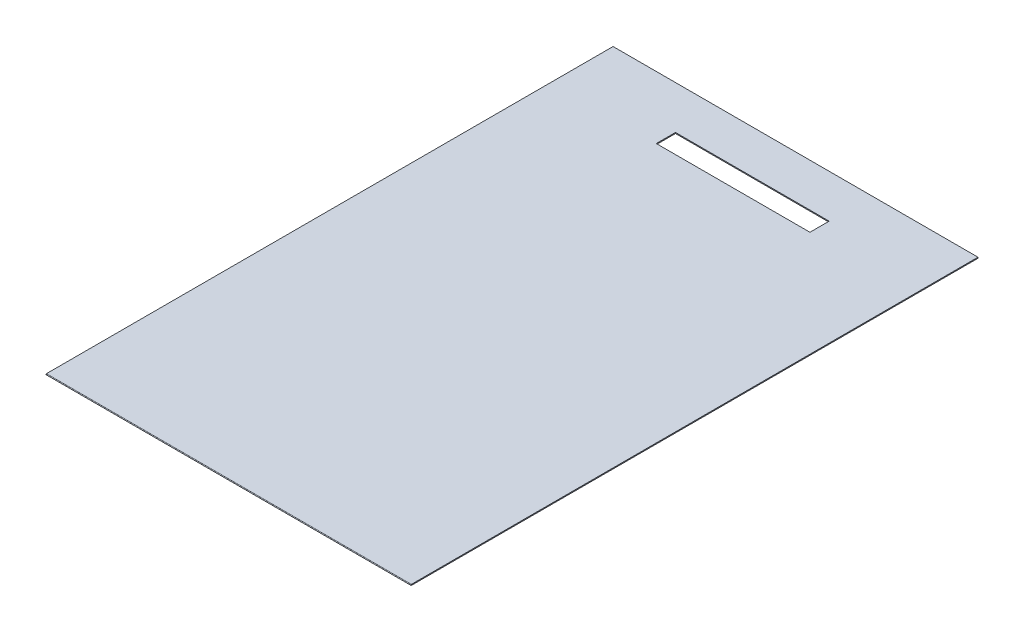
ISO-10303-21;
HEADER;
FILE_DESCRIPTION(('STEP AP214'),'2;1');
FILE_NAME('part.step','',(''),(''),'','','');
FILE_SCHEMA(('AUTOMOTIVE_DESIGN { 1 0 10303 214 1 1 1 1 }'));
ENDSEC;
DATA;
#1=APPLICATION_CONTEXT('core data for automotive mechanical design processes');
#2=APPLICATION_PROTOCOL_DEFINITION('international standard','automotive_design',2000,#1);
#3=PRODUCT_CONTEXT('',#1,'mechanical');
#4=PRODUCT('Part','Part','',(#3));
#5=PRODUCT_RELATED_PRODUCT_CATEGORY('part','',(#4));
#6=PRODUCT_DEFINITION_FORMATION('','',#4);
#7=PRODUCT_DEFINITION_CONTEXT('part definition',#1,'design');
#8=PRODUCT_DEFINITION('design','',#6,#7);
#9=PRODUCT_DEFINITION_SHAPE('','',#8);
#10=(LENGTH_UNIT() NAMED_UNIT(*) SI_UNIT(.MILLI.,.METRE.));
#11=(NAMED_UNIT(*) PLANE_ANGLE_UNIT() SI_UNIT($,.RADIAN.));
#12=(NAMED_UNIT(*) SI_UNIT($,.STERADIAN.) SOLID_ANGLE_UNIT());
#13=UNCERTAINTY_MEASURE_WITH_UNIT(LENGTH_MEASURE(1.E-05),#10,'distance_accuracy_value','');
#14=(GEOMETRIC_REPRESENTATION_CONTEXT(3) GLOBAL_UNCERTAINTY_ASSIGNED_CONTEXT((#13)) GLOBAL_UNIT_ASSIGNED_CONTEXT((#10,
#11,#12)) REPRESENTATION_CONTEXT('',''));
#15=CARTESIAN_POINT('',(0.,0.,0.));
#16=DIRECTION('',(0.,0.,1.));
#17=DIRECTION('',(1.,0.,0.));
#18=AXIS2_PLACEMENT_3D('',#15,#16,#17);
#19=CARTESIAN_POINT('',(0.,0.5,0.));
#20=DIRECTION('',(0.,-1.,0.));
#21=DIRECTION('',(0.,0.,-1.));
#22=AXIS2_PLACEMENT_3D('',#19,#20,#21);
#23=PLANE('',#22);
#24=DIRECTION('',(0.,0.,-1.));
#25=VECTOR('',#24,1.);
#26=CARTESIAN_POINT('',(95.0000000000001,0.5,147.5));
#27=LINE('',#26,#25);
#28=CARTESIAN_POINT('',(95.0000000000001,0.5,147.5));
#29=VERTEX_POINT('',#28);
#30=CARTESIAN_POINT('',(95.0000000000001,0.5,-147.5));
#31=VERTEX_POINT('',#30);
#32=EDGE_CURVE('E141',#29,#31,#27,.T.);
#33=ORIENTED_EDGE('',*,*,#32,.T.);
#34=DIRECTION('',(-1.,0.,0.));
#35=VECTOR('',#34,1.);
#36=CARTESIAN_POINT('',(-95.,0.5,-147.5));
#37=LINE('',#36,#35);
#38=CARTESIAN_POINT('',(-95.,0.5,-147.5));
#39=VERTEX_POINT('',#38);
#40=EDGE_CURVE('E145',#31,#39,#37,.T.);
#41=ORIENTED_EDGE('',*,*,#40,.T.);
#42=DIRECTION('',(0.,0.,1.));
#43=VECTOR('',#42,1.);
#44=CARTESIAN_POINT('',(-95.,0.5,147.5));
#45=LINE('',#44,#43);
#46=CARTESIAN_POINT('',(-94.9999999999999,0.5,147.5));
#47=VERTEX_POINT('',#46);
#48=EDGE_CURVE('E150',#39,#47,#45,.T.);
#49=ORIENTED_EDGE('',*,*,#48,.T.);
#50=DIRECTION('',(1.,0.,0.));
#51=VECTOR('',#50,1.);
#52=CARTESIAN_POINT('',(-95.,0.5,147.5));
#53=LINE('',#52,#51);
#54=EDGE_CURVE('E120',#47,#29,#53,.T.);
#55=ORIENTED_EDGE('',*,*,#54,.T.);
#56=EDGE_LOOP('',(#33,#41,#49,#55));
#57=FACE_BOUND('',#56,.T.);
#58=DIRECTION('',(0.,0.,-1.));
#59=VECTOR('',#58,1.);
#60=CARTESIAN_POINT('',(40.0000000000001,0.5,-125.));
#61=LINE('',#60,#59);
#62=CARTESIAN_POINT('',(40.0000000000001,0.5,-115.));
#63=VERTEX_POINT('',#62);
#64=CARTESIAN_POINT('',(40.0000000000001,0.5,-125.));
#65=VERTEX_POINT('',#64);
#66=EDGE_CURVE('E168',#63,#65,#61,.T.);
#67=ORIENTED_EDGE('',*,*,#66,.F.);
#68=DIRECTION('',(1.,0.,0.));
#69=VECTOR('',#68,1.);
#70=CARTESIAN_POINT('',(-39.9999999999999,0.5,-115.));
#71=LINE('',#70,#69);
#72=CARTESIAN_POINT('',(-39.9999999999999,0.5,-115.));
#73=VERTEX_POINT('',#72);
#74=EDGE_CURVE('E178',#73,#63,#71,.T.);
#75=ORIENTED_EDGE('',*,*,#74,.F.);
#76=DIRECTION('',(0.,0.,1.));
#77=VECTOR('',#76,1.);
#78=CARTESIAN_POINT('',(-39.9999999999999,0.5,-125.));
#79=LINE('',#78,#77);
#80=CARTESIAN_POINT('',(-39.9999999999999,0.5,-125.));
#81=VERTEX_POINT('',#80);
#82=EDGE_CURVE('E175',#81,#73,#79,.T.);
#83=ORIENTED_EDGE('',*,*,#82,.F.);
#84=DIRECTION('',(-1.,0.,0.));
#85=VECTOR('',#84,1.);
#86=CARTESIAN_POINT('',(-39.9999999999999,0.5,-125.));
#87=LINE('',#86,#85);
#88=EDGE_CURVE('E171',#65,#81,#87,.T.);
#89=ORIENTED_EDGE('',*,*,#88,.F.);
#90=EDGE_LOOP('',(#67,#75,#83,#89));
#91=FACE_BOUND('',#90,.T.);
#92=ADVANCED_FACE('F45',(#57,#91),#23,.F.);
#93=CARTESIAN_POINT('',(0.,0.,0.));
#94=DIRECTION('',(0.,-1.,0.));
#95=DIRECTION('',(0.,0.,-1.));
#96=AXIS2_PLACEMENT_3D('',#93,#94,#95);
#97=PLANE('',#96);
#98=DIRECTION('',(0.,0.,-1.));
#99=VECTOR('',#98,1.);
#100=CARTESIAN_POINT('',(95.0000000000001,0.,147.5));
#101=LINE('',#100,#99);
#102=CARTESIAN_POINT('',(95.0000000000001,0.,147.5));
#103=VERTEX_POINT('',#102);
#104=CARTESIAN_POINT('',(95.0000000000001,0.,-147.5));
#105=VERTEX_POINT('',#104);
#106=EDGE_CURVE('E139',#103,#105,#101,.T.);
#107=ORIENTED_EDGE('',*,*,#106,.F.);
#108=DIRECTION('',(1.,0.,0.));
#109=VECTOR('',#108,1.);
#110=CARTESIAN_POINT('',(-95.,0.,147.5));
#111=LINE('',#110,#109);
#112=CARTESIAN_POINT('',(-94.9999999999999,0.,147.5));
#113=VERTEX_POINT('',#112);
#114=EDGE_CURVE('E117',#113,#103,#111,.T.);
#115=ORIENTED_EDGE('',*,*,#114,.F.);
#116=DIRECTION('',(0.,0.,1.));
#117=VECTOR('',#116,1.);
#118=CARTESIAN_POINT('',(-95.,0.,147.5));
#119=LINE('',#118,#117);
#120=CARTESIAN_POINT('',(-95.,0.,-147.5));
#121=VERTEX_POINT('',#120);
#122=EDGE_CURVE('E129',#121,#113,#119,.T.);
#123=ORIENTED_EDGE('',*,*,#122,.F.);
#124=DIRECTION('',(-1.,0.,0.));
#125=VECTOR('',#124,1.);
#126=CARTESIAN_POINT('',(-95.,0.,-147.5));
#127=LINE('',#126,#125);
#128=EDGE_CURVE('E134',#105,#121,#127,.T.);
#129=ORIENTED_EDGE('',*,*,#128,.F.);
#130=EDGE_LOOP('',(#107,#115,#123,#129));
#131=FACE_BOUND('',#130,.T.);
#132=DIRECTION('',(1.,0.,0.));
#133=VECTOR('',#132,1.);
#134=CARTESIAN_POINT('',(-39.9999999999999,0.,-115.));
#135=LINE('',#134,#133);
#136=CARTESIAN_POINT('',(-39.9999999999999,0.,-115.));
#137=VERTEX_POINT('',#136);
#138=CARTESIAN_POINT('',(40.0000000000001,0.,-115.));
#139=VERTEX_POINT('',#138);
#140=EDGE_CURVE('E172',#137,#139,#135,.T.);
#141=ORIENTED_EDGE('',*,*,#140,.T.);
#142=DIRECTION('',(0.,0.,-1.));
#143=VECTOR('',#142,1.);
#144=CARTESIAN_POINT('',(40.0000000000001,0.,-125.));
#145=LINE('',#144,#143);
#146=CARTESIAN_POINT('',(40.0000000000001,0.,-125.));
#147=VERTEX_POINT('',#146);
#148=EDGE_CURVE('E69',#139,#147,#145,.T.);
#149=ORIENTED_EDGE('',*,*,#148,.T.);
#150=DIRECTION('',(-1.,0.,0.));
#151=VECTOR('',#150,1.);
#152=CARTESIAN_POINT('',(-39.9999999999999,0.,-125.));
#153=LINE('',#152,#151);
#154=CARTESIAN_POINT('',(-39.9999999999999,0.,-125.));
#155=VERTEX_POINT('',#154);
#156=EDGE_CURVE('E184',#147,#155,#153,.T.);
#157=ORIENTED_EDGE('',*,*,#156,.T.);
#158=DIRECTION('',(0.,0.,1.));
#159=VECTOR('',#158,1.);
#160=CARTESIAN_POINT('',(-39.9999999999999,0.,-125.));
#161=LINE('',#160,#159);
#162=EDGE_CURVE('E188',#155,#137,#161,.T.);
#163=ORIENTED_EDGE('',*,*,#162,.T.);
#164=EDGE_LOOP('',(#141,#149,#157,#163));
#165=FACE_BOUND('',#164,.T.);
#166=ADVANCED_FACE('F136',(#131,#165),#97,.T.);
#167=CARTESIAN_POINT('',(95.0000000000001,0.5,147.5));
#168=DIRECTION('',(-1.,0.,0.));
#169=DIRECTION('',(0.,0.,1.));
#170=AXIS2_PLACEMENT_3D('',#167,#168,#169);
#171=PLANE('',#170);
#172=ORIENTED_EDGE('',*,*,#106,.T.);
#173=DIRECTION('',(0.,-1.,0.));
#174=VECTOR('',#173,1.);
#175=CARTESIAN_POINT('',(95.0000000000001,0.5,-147.5));
#176=LINE('',#175,#174);
#177=EDGE_CURVE('E11',#31,#105,#176,.T.);
#178=ORIENTED_EDGE('',*,*,#177,.F.);
#179=ORIENTED_EDGE('',*,*,#32,.F.);
#180=CARTESIAN_POINT('',(95.0000000000001,0.25,147.5));
#181=DIRECTION('',(1.,0.,0.));
#182=DIRECTION('',(0.,0.,-1.));
#183=AXIS2_PLACEMENT_3D('',#180,#181,#182);
#184=CIRCLE('',#183,0.25);
#185=EDGE_CURVE('E125',#29,#103,#184,.T.);
#186=ORIENTED_EDGE('',*,*,#185,.T.);
#187=EDGE_LOOP('',(#172,#178,#179,#186));
#188=FACE_BOUND('',#187,.T.);
#189=ADVANCED_FACE('F47',(#188),#171,.F.);
#190=CARTESIAN_POINT('',(-95.,0.5,-147.5));
#191=DIRECTION('',(0.,0.,1.));
#192=DIRECTION('',(1.,0.,0.));
#193=AXIS2_PLACEMENT_3D('',#190,#191,#192);
#194=PLANE('',#193);
#195=ORIENTED_EDGE('',*,*,#128,.T.);
#196=DIRECTION('',(0.,-1.,0.));
#197=VECTOR('',#196,1.);
#198=CARTESIAN_POINT('',(-95.,0.5,-147.5));
#199=LINE('',#198,#197);
#200=EDGE_CURVE('E54',#39,#121,#199,.T.);
#201=ORIENTED_EDGE('',*,*,#200,.F.);
#202=ORIENTED_EDGE('',*,*,#40,.F.);
#203=ORIENTED_EDGE('',*,*,#177,.T.);
#204=EDGE_LOOP('',(#195,#201,#202,#203));
#205=FACE_BOUND('',#204,.T.);
#206=ADVANCED_FACE('F162',(#205),#194,.F.);
#207=CARTESIAN_POINT('',(-95.,0.5,147.5));
#208=DIRECTION('',(1.,0.,0.));
#209=DIRECTION('',(0.,0.,-1.));
#210=AXIS2_PLACEMENT_3D('',#207,#208,#209);
#211=PLANE('',#210);
#212=ORIENTED_EDGE('',*,*,#122,.T.);
#213=CARTESIAN_POINT('',(-94.9999999999999,0.25,147.5));
#214=DIRECTION('',(1.,0.,0.));
#215=DIRECTION('',(0.,0.,-1.));
#216=AXIS2_PLACEMENT_3D('',#213,#214,#215);
#217=CIRCLE('',#216,0.25);
#218=EDGE_CURVE('E113',#47,#113,#217,.T.);
#219=ORIENTED_EDGE('',*,*,#218,.F.);
#220=ORIENTED_EDGE('',*,*,#48,.F.);
#221=ORIENTED_EDGE('',*,*,#200,.T.);
#222=EDGE_LOOP('',(#212,#219,#220,#221));
#223=FACE_BOUND('',#222,.T.);
#224=ADVANCED_FACE('F130',(#223),#211,.F.);
#225=CARTESIAN_POINT('',(40.0000000000001,0.5,-125.));
#226=DIRECTION('',(-1.,0.,0.));
#227=DIRECTION('',(0.,0.,1.));
#228=AXIS2_PLACEMENT_3D('',#225,#226,#227);
#229=PLANE('',#228);
#230=ORIENTED_EDGE('',*,*,#148,.F.);
#231=DIRECTION('',(0.,-1.,0.));
#232=VECTOR('',#231,1.);
#233=CARTESIAN_POINT('',(40.0000000000001,0.5,-115.));
#234=LINE('',#233,#232);
#235=EDGE_CURVE('E181',#63,#139,#234,.T.);
#236=ORIENTED_EDGE('',*,*,#235,.F.);
#237=ORIENTED_EDGE('',*,*,#66,.T.);
#238=DIRECTION('',(0.,-1.,0.));
#239=VECTOR('',#238,1.);
#240=CARTESIAN_POINT('',(40.0000000000001,0.5,-125.));
#241=LINE('',#240,#239);
#242=EDGE_CURVE('E159',#65,#147,#241,.T.);
#243=ORIENTED_EDGE('',*,*,#242,.T.);
#244=EDGE_LOOP('',(#230,#236,#237,#243));
#245=FACE_BOUND('',#244,.T.);
#246=ADVANCED_FACE('F212',(#245),#229,.T.);
#247=CARTESIAN_POINT('',(-39.9999999999999,0.5,-125.));
#248=DIRECTION('',(0.,0.,1.));
#249=DIRECTION('',(1.,0.,0.));
#250=AXIS2_PLACEMENT_3D('',#247,#248,#249);
#251=PLANE('',#250);
#252=ORIENTED_EDGE('',*,*,#156,.F.);
#253=ORIENTED_EDGE('',*,*,#242,.F.);
#254=ORIENTED_EDGE('',*,*,#88,.T.);
#255=DIRECTION('',(0.,-1.,0.));
#256=VECTOR('',#255,1.);
#257=CARTESIAN_POINT('',(-39.9999999999999,0.5,-125.));
#258=LINE('',#257,#256);
#259=EDGE_CURVE('E199',#81,#155,#258,.T.);
#260=ORIENTED_EDGE('',*,*,#259,.T.);
#261=EDGE_LOOP('',(#252,#253,#254,#260));
#262=FACE_BOUND('',#261,.T.);
#263=ADVANCED_FACE('F214',(#262),#251,.T.);
#264=CARTESIAN_POINT('',(-39.9999999999999,0.5,-125.));
#265=DIRECTION('',(1.,0.,0.));
#266=DIRECTION('',(0.,0.,-1.));
#267=AXIS2_PLACEMENT_3D('',#264,#265,#266);
#268=PLANE('',#267);
#269=ORIENTED_EDGE('',*,*,#162,.F.);
#270=ORIENTED_EDGE('',*,*,#259,.F.);
#271=ORIENTED_EDGE('',*,*,#82,.T.);
#272=DIRECTION('',(0.,-1.,0.));
#273=VECTOR('',#272,1.);
#274=CARTESIAN_POINT('',(-39.9999999999999,0.5,-115.));
#275=LINE('',#274,#273);
#276=EDGE_CURVE('E61',#73,#137,#275,.T.);
#277=ORIENTED_EDGE('',*,*,#276,.T.);
#278=EDGE_LOOP('',(#269,#270,#271,#277));
#279=FACE_BOUND('',#278,.T.);
#280=ADVANCED_FACE('F219',(#279),#268,.T.);
#281=CARTESIAN_POINT('',(-39.9999999999999,0.5,-115.));
#282=DIRECTION('',(0.,0.,-1.));
#283=DIRECTION('',(-1.,0.,0.));
#284=AXIS2_PLACEMENT_3D('',#281,#282,#283);
#285=PLANE('',#284);
#286=ORIENTED_EDGE('',*,*,#140,.F.);
#287=ORIENTED_EDGE('',*,*,#276,.F.);
#288=ORIENTED_EDGE('',*,*,#74,.T.);
#289=ORIENTED_EDGE('',*,*,#235,.T.);
#290=EDGE_LOOP('',(#286,#287,#288,#289));
#291=FACE_BOUND('',#290,.T.);
#292=ADVANCED_FACE('F217',(#291),#285,.T.);
#293=CARTESIAN_POINT('',(-94.9999999999999,0.25,147.5));
#294=DIRECTION('',(1.,0.,0.));
#295=DIRECTION('',(0.,0.,-1.));
#296=AXIS2_PLACEMENT_3D('',#293,#294,#295);
#297=CYLINDRICAL_SURFACE('',#296,0.25);
#298=ORIENTED_EDGE('',*,*,#185,.F.);
#299=ORIENTED_EDGE('',*,*,#54,.F.);
#300=ORIENTED_EDGE('',*,*,#218,.T.);
#301=ORIENTED_EDGE('',*,*,#114,.T.);
#302=EDGE_LOOP('',(#298,#299,#300,#301));
#303=FACE_BOUND('',#302,.T.);
#304=ADVANCED_FACE('F115',(#303),#297,.T.);
#305=CLOSED_SHELL('',(#92,#166,#189,#206,#224,#246,#263,#280,#292,#304));
#306=MANIFOLD_SOLID_BREP('B2',#305);
#307=ADVANCED_BREP_SHAPE_REPRESENTATION('',(#18,#306),#14);
#308=SHAPE_DEFINITION_REPRESENTATION(#9,#307);
ENDSEC;
END-ISO-10303-21;
